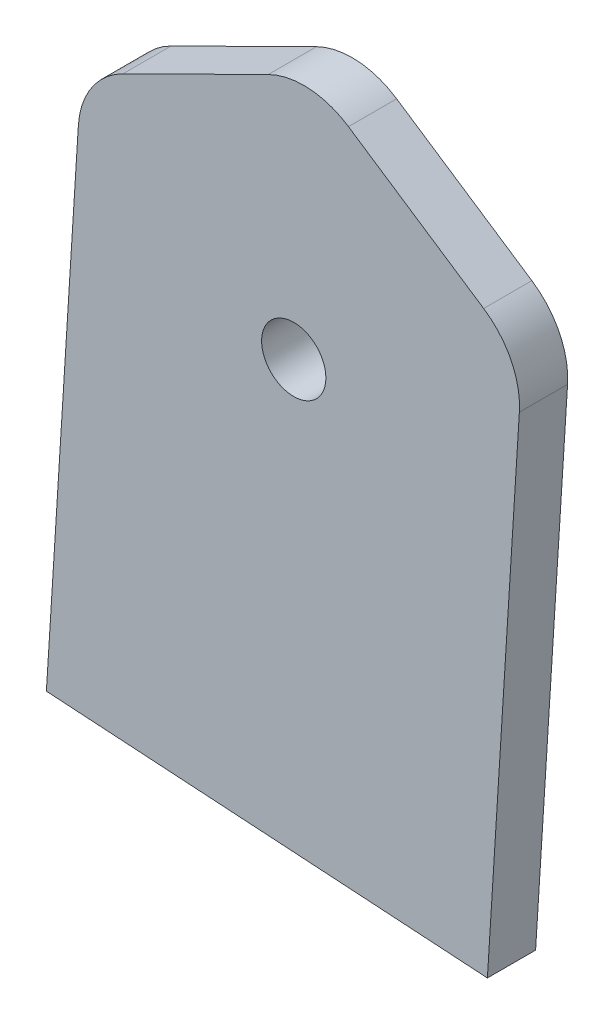
ISO-10303-21;
HEADER;
FILE_DESCRIPTION(('STEP AP214'),'2;1');
FILE_NAME('part.step','',(''),(''),'','','');
FILE_SCHEMA(('AUTOMOTIVE_DESIGN { 1 0 10303 214 1 1 1 1 }'));
ENDSEC;
DATA;
#1=APPLICATION_CONTEXT('core data for automotive mechanical design processes');
#2=APPLICATION_PROTOCOL_DEFINITION('international standard','automotive_design',2000,#1);
#3=PRODUCT_CONTEXT('',#1,'mechanical');
#4=PRODUCT('Part','Part','',(#3));
#5=PRODUCT_RELATED_PRODUCT_CATEGORY('part','',(#4));
#6=PRODUCT_DEFINITION_FORMATION('','',#4);
#7=PRODUCT_DEFINITION_CONTEXT('part definition',#1,'design');
#8=PRODUCT_DEFINITION('design','',#6,#7);
#9=PRODUCT_DEFINITION_SHAPE('','',#8);
#10=(LENGTH_UNIT() NAMED_UNIT(*) SI_UNIT(.MILLI.,.METRE.));
#11=(NAMED_UNIT(*) PLANE_ANGLE_UNIT() SI_UNIT($,.RADIAN.));
#12=(NAMED_UNIT(*) SI_UNIT($,.STERADIAN.) SOLID_ANGLE_UNIT());
#13=UNCERTAINTY_MEASURE_WITH_UNIT(LENGTH_MEASURE(1.E-05),#10,'distance_accuracy_value','');
#14=(GEOMETRIC_REPRESENTATION_CONTEXT(3) GLOBAL_UNCERTAINTY_ASSIGNED_CONTEXT((#13)) GLOBAL_UNIT_ASSIGNED_CONTEXT((#10,
#11,#12)) REPRESENTATION_CONTEXT('',''));
#15=CARTESIAN_POINT('',(0.,0.,0.));
#16=DIRECTION('',(0.,0.,1.));
#17=DIRECTION('',(1.,0.,0.));
#18=AXIS2_PLACEMENT_3D('',#15,#16,#17);
#19=CARTESIAN_POINT('',(-171.269353894393,287.833625633372,6.));
#20=DIRECTION('',(0.,0.,-1.));
#21=DIRECTION('',(-1.,0.,0.));
#22=AXIS2_PLACEMENT_3D('',#19,#20,#21);
#23=PLANE('',#22);
#24=CARTESIAN_POINT('',(-171.269353894393,287.833625633372,6.));
#25=DIRECTION('',(0.,0.,1.));
#26=DIRECTION('',(-1.,0.,0.));
#27=AXIS2_PLACEMENT_3D('',#24,#25,#26);
#28=CIRCLE('',#27,9.99999999999997);
#29=CARTESIAN_POINT('',(-175.713175714069,296.791998679577,6.));
#30=VERTEX_POINT('',#29);
#31=CARTESIAN_POINT('',(-181.249443438822,288.464349570744,6.));
#32=VERTEX_POINT('',#31);
#33=EDGE_CURVE('E168',#30,#32,#28,.T.);
#34=ORIENTED_EDGE('',*,*,#33,.T.);
#35=DIRECTION('',(-0.063072393737164,-0.998008954442927,0.));
#36=VECTOR('',#35,1.);
#37=CARTESIAN_POINT('',(-181.249443438822,288.464349570744,6.));
#38=LINE('',#37,#36);
#39=CARTESIAN_POINT('',(-185.22952079005,225.486672642007,6.));
#40=VERTEX_POINT('',#39);
#41=EDGE_CURVE('E104',#32,#40,#38,.T.);
#42=ORIENTED_EDGE('',*,*,#41,.T.);
#43=DIRECTION('',(0.998008954442927,-0.0630723937371667,0.));
#44=VECTOR('',#43,1.);
#45=CARTESIAN_POINT('',(-185.22952079005,225.486672642007,6.));
#46=LINE('',#45,#44);
#47=CARTESIAN_POINT('',(-130.339131129325,222.017697485366,6.));
#48=VERTEX_POINT('',#47);
#49=EDGE_CURVE('E189',#40,#48,#46,.T.);
#50=ORIENTED_EDGE('',*,*,#49,.T.);
#51=DIRECTION('',(0.0630723937371716,0.998008954442926,0.));
#52=VECTOR('',#51,1.);
#53=CARTESIAN_POINT('',(-130.339131129325,222.017697485366,6.));
#54=LINE('',#53,#52);
#55=CARTESIAN_POINT('',(-126.359053778097,284.995374414102,6.));
#56=VERTEX_POINT('',#55);
#57=EDGE_CURVE('E203',#48,#56,#54,.T.);
#58=ORIENTED_EDGE('',*,*,#57,.T.);
#59=CARTESIAN_POINT('',(-136.339143322526,285.626098351474,6.));
#60=DIRECTION('',(0.,0.,1.));
#61=DIRECTION('',(-1.,0.,0.));
#62=AXIS2_PLACEMENT_3D('',#59,#60,#61);
#63=CIRCLE('',#62,9.99999999999994);
#64=CARTESIAN_POINT('',(-130.802875597772,293.953747460308,6.));
#65=VERTEX_POINT('',#64);
#66=EDGE_CURVE('E123',#56,#65,#63,.T.);
#67=ORIENTED_EDGE('',*,*,#66,.T.);
#68=DIRECTION('',(-0.832764910883335,0.553626772475348,0.));
#69=VECTOR('',#68,1.);
#70=CARTESIAN_POINT('',(-147.630722648482,305.140994339515,6.));
#71=LINE('',#70,#69);
#72=CARTESIAN_POINT('',(-147.630722648482,305.140994339515,6.));
#73=VERTEX_POINT('',#72);
#74=EDGE_CURVE('E117',#65,#73,#71,.T.);
#75=ORIENTED_EDGE('',*,*,#74,.T.);
#76=CARTESIAN_POINT('',(-153.166990373236,296.813345230682,6.));
#77=DIRECTION('',(0.,0.,1.));
#78=DIRECTION('',(-1.,0.,0.));
#79=AXIS2_PLACEMENT_3D('',#76,#77,#78);
#80=CIRCLE('',#79,10.0000000000001);
#81=CARTESIAN_POINT('',(-157.610812192912,305.771718276887,6.));
#82=VERTEX_POINT('',#81);
#83=EDGE_CURVE('E121',#73,#82,#80,.T.);
#84=ORIENTED_EDGE('',*,*,#83,.T.);
#85=DIRECTION('',(-0.8958373046205,-0.444382181967591,0.));
#86=VECTOR('',#85,1.);
#87=CARTESIAN_POINT('',(-175.713175714069,296.791998679577,6.));
#88=LINE('',#87,#86);
#89=EDGE_CURVE('E61',#82,#30,#88,.T.);
#90=ORIENTED_EDGE('',*,*,#89,.T.);
#91=EDGE_LOOP('',(#34,#42,#50,#58,#67,#75,#84,#90));
#92=FACE_BOUND('',#91,.T.);
#93=CARTESIAN_POINT('',(-154.441734867479,276.643587510885,6.));
#94=DIRECTION('',(0.,0.,1.));
#95=DIRECTION('',(1.,0.,0.));
#96=AXIS2_PLACEMENT_3D('',#93,#94,#95);
#97=CIRCLE('',#96,3.99999999999999);
#98=CARTESIAN_POINT('',(-150.441734867479,276.643587510885,6.));
#99=VERTEX_POINT('',#98);
#100=EDGE_CURVE('E150',#99,#99,#97,.T.);
#101=ORIENTED_EDGE('',*,*,#100,.F.);
#102=EDGE_LOOP('',(#101));
#103=FACE_BOUND('',#102,.T.);
#104=ADVANCED_FACE('F43',(#92,#103),#23,.F.);
#105=CARTESIAN_POINT('',(-171.269353894393,287.833625633372,0.));
#106=DIRECTION('',(0.,0.,-1.));
#107=DIRECTION('',(-1.,0.,0.));
#108=AXIS2_PLACEMENT_3D('',#105,#106,#107);
#109=PLANE('',#108);
#110=CARTESIAN_POINT('',(-171.269353894393,287.833625633372,0.));
#111=DIRECTION('',(0.,0.,1.));
#112=DIRECTION('',(-1.,0.,0.));
#113=AXIS2_PLACEMENT_3D('',#110,#111,#112);
#114=CIRCLE('',#113,9.99999999999997);
#115=CARTESIAN_POINT('',(-175.713175714069,296.791998679577,0.));
#116=VERTEX_POINT('',#115);
#117=CARTESIAN_POINT('',(-181.249443438822,288.464349570744,0.));
#118=VERTEX_POINT('',#117);
#119=EDGE_CURVE('E145',#116,#118,#114,.T.);
#120=ORIENTED_EDGE('',*,*,#119,.F.);
#121=DIRECTION('',(-0.8958373046205,-0.444382181967591,0.));
#122=VECTOR('',#121,1.);
#123=CARTESIAN_POINT('',(-175.713175714069,296.791998679577,0.));
#124=LINE('',#123,#122);
#125=CARTESIAN_POINT('',(-157.610812192912,305.771718276887,0.));
#126=VERTEX_POINT('',#125);
#127=EDGE_CURVE('E96',#126,#116,#124,.T.);
#128=ORIENTED_EDGE('',*,*,#127,.F.);
#129=CARTESIAN_POINT('',(-153.166990373236,296.813345230682,0.));
#130=DIRECTION('',(0.,0.,1.));
#131=DIRECTION('',(-1.,0.,0.));
#132=AXIS2_PLACEMENT_3D('',#129,#130,#131);
#133=CIRCLE('',#132,10.0000000000001);
#134=CARTESIAN_POINT('',(-147.630722648482,305.140994339515,0.));
#135=VERTEX_POINT('',#134);
#136=EDGE_CURVE('E90',#135,#126,#133,.T.);
#137=ORIENTED_EDGE('',*,*,#136,.F.);
#138=DIRECTION('',(-0.832764910883335,0.553626772475348,0.));
#139=VECTOR('',#138,1.);
#140=CARTESIAN_POINT('',(-147.630722648482,305.140994339515,0.));
#141=LINE('',#140,#139);
#142=CARTESIAN_POINT('',(-130.802875597772,293.953747460308,0.));
#143=VERTEX_POINT('',#142);
#144=EDGE_CURVE('E132',#143,#135,#141,.T.);
#145=ORIENTED_EDGE('',*,*,#144,.F.);
#146=CARTESIAN_POINT('',(-136.339143322526,285.626098351474,0.));
#147=DIRECTION('',(0.,0.,1.));
#148=DIRECTION('',(-1.,0.,0.));
#149=AXIS2_PLACEMENT_3D('',#146,#147,#148);
#150=CIRCLE('',#149,9.99999999999994);
#151=CARTESIAN_POINT('',(-126.359053778097,284.995374414102,0.));
#152=VERTEX_POINT('',#151);
#153=EDGE_CURVE('E159',#152,#143,#150,.T.);
#154=ORIENTED_EDGE('',*,*,#153,.F.);
#155=DIRECTION('',(0.0630723937371716,0.998008954442926,0.));
#156=VECTOR('',#155,1.);
#157=CARTESIAN_POINT('',(-130.339131129325,222.017697485366,0.));
#158=LINE('',#157,#156);
#159=CARTESIAN_POINT('',(-130.339131129325,222.017697485366,0.));
#160=VERTEX_POINT('',#159);
#161=EDGE_CURVE('E156',#160,#152,#158,.T.);
#162=ORIENTED_EDGE('',*,*,#161,.F.);
#163=DIRECTION('',(0.998008954442927,-0.0630723937371667,0.));
#164=VECTOR('',#163,1.);
#165=CARTESIAN_POINT('',(-185.22952079005,225.486672642007,0.));
#166=LINE('',#165,#164);
#167=CARTESIAN_POINT('',(-185.22952079005,225.486672642007,0.));
#168=VERTEX_POINT('',#167);
#169=EDGE_CURVE('E153',#168,#160,#166,.T.);
#170=ORIENTED_EDGE('',*,*,#169,.F.);
#171=DIRECTION('',(-0.063072393737164,-0.998008954442927,0.));
#172=VECTOR('',#171,1.);
#173=CARTESIAN_POINT('',(-181.249443438822,288.464349570744,0.));
#174=LINE('',#173,#172);
#175=EDGE_CURVE('E149',#118,#168,#174,.T.);
#176=ORIENTED_EDGE('',*,*,#175,.F.);
#177=EDGE_LOOP('',(#120,#128,#137,#145,#154,#162,#170,#176));
#178=FACE_BOUND('',#177,.T.);
#179=CARTESIAN_POINT('',(-154.441734867479,276.643587510885,0.));
#180=DIRECTION('',(0.,0.,1.));
#181=DIRECTION('',(1.,0.,0.));
#182=AXIS2_PLACEMENT_3D('',#179,#180,#181);
#183=CIRCLE('',#182,3.99999999999999);
#184=CARTESIAN_POINT('',(-150.441734867479,276.643587510885,0.));
#185=VERTEX_POINT('',#184);
#186=EDGE_CURVE('E213',#185,#185,#183,.T.);
#187=ORIENTED_EDGE('',*,*,#186,.T.);
#188=EDGE_LOOP('',(#187));
#189=FACE_BOUND('',#188,.T.);
#190=ADVANCED_FACE('F193',(#178,#189),#109,.T.);
#191=CARTESIAN_POINT('',(-171.269353894393,287.833625633372,6.));
#192=DIRECTION('',(0.,0.,-1.));
#193=DIRECTION('',(-1.,0.,0.));
#194=AXIS2_PLACEMENT_3D('',#191,#192,#193);
#195=CYLINDRICAL_SURFACE('',#194,9.99999999999997);
#196=ORIENTED_EDGE('',*,*,#119,.T.);
#197=DIRECTION('',(0.,0.,-1.));
#198=VECTOR('',#197,1.);
#199=CARTESIAN_POINT('',(-181.249443438822,288.464349570744,6.));
#200=LINE('',#199,#198);
#201=EDGE_CURVE('E11',#32,#118,#200,.T.);
#202=ORIENTED_EDGE('',*,*,#201,.F.);
#203=ORIENTED_EDGE('',*,*,#33,.F.);
#204=DIRECTION('',(0.,0.,-1.));
#205=VECTOR('',#204,1.);
#206=CARTESIAN_POINT('',(-175.713175714069,296.791998679577,6.));
#207=LINE('',#206,#205);
#208=EDGE_CURVE('E141',#30,#116,#207,.T.);
#209=ORIENTED_EDGE('',*,*,#208,.T.);
#210=EDGE_LOOP('',(#196,#202,#203,#209));
#211=FACE_BOUND('',#210,.T.);
#212=ADVANCED_FACE('F45',(#211),#195,.T.);
#213=CARTESIAN_POINT('',(-181.249443438822,288.464349570744,6.));
#214=DIRECTION('',(0.998008954442927,-0.063072393737164,0.));
#215=DIRECTION('',(0.063072393737164,0.998008954442927,0.));
#216=AXIS2_PLACEMENT_3D('',#213,#214,#215);
#217=PLANE('',#216);
#218=ORIENTED_EDGE('',*,*,#175,.T.);
#219=DIRECTION('',(0.,0.,-1.));
#220=VECTOR('',#219,1.);
#221=CARTESIAN_POINT('',(-185.22952079005,225.486672642007,6.));
#222=LINE('',#221,#220);
#223=EDGE_CURVE('E53',#40,#168,#222,.T.);
#224=ORIENTED_EDGE('',*,*,#223,.F.);
#225=ORIENTED_EDGE('',*,*,#41,.F.);
#226=ORIENTED_EDGE('',*,*,#201,.T.);
#227=EDGE_LOOP('',(#218,#224,#225,#226));
#228=FACE_BOUND('',#227,.T.);
#229=ADVANCED_FACE('F243',(#228),#217,.F.);
#230=CARTESIAN_POINT('',(-185.22952079005,225.486672642007,6.));
#231=DIRECTION('',(0.0630723937371667,0.998008954442927,0.));
#232=DIRECTION('',(-0.998008954442927,0.0630723937371668,0.));
#233=AXIS2_PLACEMENT_3D('',#230,#231,#232);
#234=PLANE('',#233);
#235=ORIENTED_EDGE('',*,*,#169,.T.);
#236=DIRECTION('',(0.,0.,-1.));
#237=VECTOR('',#236,1.);
#238=CARTESIAN_POINT('',(-130.339131129325,222.017697485366,6.));
#239=LINE('',#238,#237);
#240=EDGE_CURVE('E179',#48,#160,#239,.T.);
#241=ORIENTED_EDGE('',*,*,#240,.F.);
#242=ORIENTED_EDGE('',*,*,#49,.F.);
#243=ORIENTED_EDGE('',*,*,#223,.T.);
#244=EDGE_LOOP('',(#235,#241,#242,#243));
#245=FACE_BOUND('',#244,.T.);
#246=ADVANCED_FACE('F187',(#245),#234,.F.);
#247=CARTESIAN_POINT('',(-130.339131129325,222.017697485366,6.));
#248=DIRECTION('',(-0.998008954442926,0.0630723937371716,0.));
#249=DIRECTION('',(-0.0630723937371716,-0.998008954442926,0.));
#250=AXIS2_PLACEMENT_3D('',#247,#248,#249);
#251=PLANE('',#250);
#252=ORIENTED_EDGE('',*,*,#161,.T.);
#253=DIRECTION('',(0.,0.,-1.));
#254=VECTOR('',#253,1.);
#255=CARTESIAN_POINT('',(-126.359053778097,284.995374414102,6.));
#256=LINE('',#255,#254);
#257=EDGE_CURVE('E175',#56,#152,#256,.T.);
#258=ORIENTED_EDGE('',*,*,#257,.F.);
#259=ORIENTED_EDGE('',*,*,#57,.F.);
#260=ORIENTED_EDGE('',*,*,#240,.T.);
#261=EDGE_LOOP('',(#252,#258,#259,#260));
#262=FACE_BOUND('',#261,.T.);
#263=ADVANCED_FACE('F198',(#262),#251,.F.);
#264=CARTESIAN_POINT('',(-136.339143322526,285.626098351474,6.));
#265=DIRECTION('',(0.,0.,-1.));
#266=DIRECTION('',(-1.,0.,0.));
#267=AXIS2_PLACEMENT_3D('',#264,#265,#266);
#268=CYLINDRICAL_SURFACE('',#267,9.99999999999994);
#269=ORIENTED_EDGE('',*,*,#153,.T.);
#270=DIRECTION('',(0.,0.,-1.));
#271=VECTOR('',#270,1.);
#272=CARTESIAN_POINT('',(-130.802875597772,293.953747460308,6.));
#273=LINE('',#272,#271);
#274=EDGE_CURVE('E134',#65,#143,#273,.T.);
#275=ORIENTED_EDGE('',*,*,#274,.F.);
#276=ORIENTED_EDGE('',*,*,#66,.F.);
#277=ORIENTED_EDGE('',*,*,#257,.T.);
#278=EDGE_LOOP('',(#269,#275,#276,#277));
#279=FACE_BOUND('',#278,.T.);
#280=ADVANCED_FACE('F201',(#279),#268,.T.);
#281=CARTESIAN_POINT('',(-147.630722648482,305.140994339515,6.));
#282=DIRECTION('',(-0.553626772475348,-0.832764910883335,0.));
#283=DIRECTION('',(0.832764910883335,-0.553626772475348,0.));
#284=AXIS2_PLACEMENT_3D('',#281,#282,#283);
#285=PLANE('',#284);
#286=ORIENTED_EDGE('',*,*,#144,.T.);
#287=DIRECTION('',(0.,0.,-1.));
#288=VECTOR('',#287,1.);
#289=CARTESIAN_POINT('',(-147.630722648482,305.140994339515,6.));
#290=LINE('',#289,#288);
#291=EDGE_CURVE('E129',#73,#135,#290,.T.);
#292=ORIENTED_EDGE('',*,*,#291,.F.);
#293=ORIENTED_EDGE('',*,*,#74,.F.);
#294=ORIENTED_EDGE('',*,*,#274,.T.);
#295=EDGE_LOOP('',(#286,#292,#293,#294));
#296=FACE_BOUND('',#295,.T.);
#297=ADVANCED_FACE('F130',(#296),#285,.F.);
#298=CARTESIAN_POINT('',(-153.166990373236,296.813345230682,6.));
#299=DIRECTION('',(0.,0.,-1.));
#300=DIRECTION('',(-1.,0.,0.));
#301=AXIS2_PLACEMENT_3D('',#298,#299,#300);
#302=CYLINDRICAL_SURFACE('',#301,10.0000000000001);
#303=ORIENTED_EDGE('',*,*,#136,.T.);
#304=DIRECTION('',(0.,0.,-1.));
#305=VECTOR('',#304,1.);
#306=CARTESIAN_POINT('',(-157.610812192912,305.771718276887,6.));
#307=LINE('',#306,#305);
#308=EDGE_CURVE('E135',#82,#126,#307,.T.);
#309=ORIENTED_EDGE('',*,*,#308,.F.);
#310=ORIENTED_EDGE('',*,*,#83,.F.);
#311=ORIENTED_EDGE('',*,*,#291,.T.);
#312=EDGE_LOOP('',(#303,#309,#310,#311));
#313=FACE_BOUND('',#312,.T.);
#314=ADVANCED_FACE('F137',(#313),#302,.T.);
#315=CARTESIAN_POINT('',(-175.713175714069,296.791998679577,6.));
#316=DIRECTION('',(0.444382181967591,-0.8958373046205,0.));
#317=DIRECTION('',(0.8958373046205,0.444382181967591,0.));
#318=AXIS2_PLACEMENT_3D('',#315,#316,#317);
#319=PLANE('',#318);
#320=ORIENTED_EDGE('',*,*,#127,.T.);
#321=ORIENTED_EDGE('',*,*,#208,.F.);
#322=ORIENTED_EDGE('',*,*,#89,.F.);
#323=ORIENTED_EDGE('',*,*,#308,.T.);
#324=EDGE_LOOP('',(#320,#321,#322,#323));
#325=FACE_BOUND('',#324,.T.);
#326=ADVANCED_FACE('F231',(#325),#319,.F.);
#327=CARTESIAN_POINT('',(-154.441734867479,276.643587510885,6.));
#328=DIRECTION('',(0.,0.,-1.));
#329=DIRECTION('',(-1.,0.,0.));
#330=AXIS2_PLACEMENT_3D('',#327,#328,#329);
#331=CYLINDRICAL_SURFACE('',#330,3.99999999999999);
#332=ORIENTED_EDGE('',*,*,#100,.T.);
#333=EDGE_LOOP('',(#332));
#334=FACE_BOUND('',#333,.T.);
#335=ORIENTED_EDGE('',*,*,#186,.F.);
#336=EDGE_LOOP('',(#335));
#337=FACE_BOUND('',#336,.T.);
#338=ADVANCED_FACE('F221',(#334,#337),#331,.F.);
#339=CLOSED_SHELL('',(#104,#190,#212,#229,#246,#263,#280,#297,#314,#326,#338));
#340=MANIFOLD_SOLID_BREP('B2',#339);
#341=ADVANCED_BREP_SHAPE_REPRESENTATION('',(#18,#340),#14);
#342=SHAPE_DEFINITION_REPRESENTATION(#9,#341);
ENDSEC;
END-ISO-10303-21;
